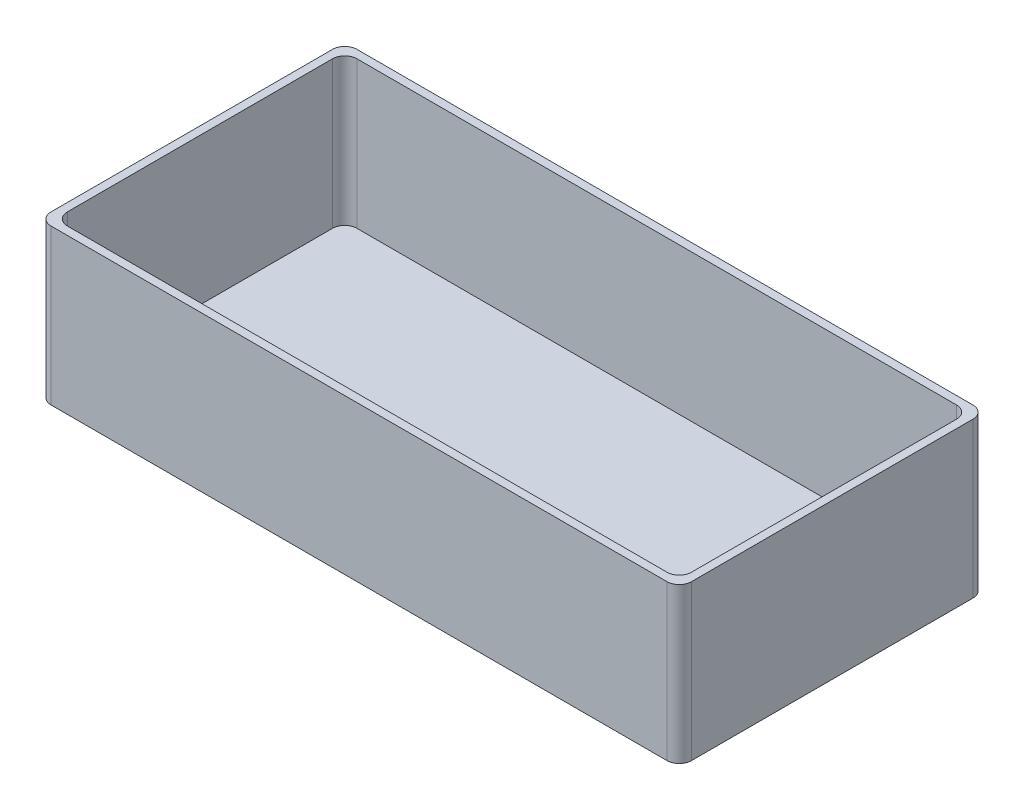
ISO-10303-21;
HEADER;
FILE_DESCRIPTION(('STEP AP214'),'2;1');
FILE_NAME('part.step','',(''),(''),'','','');
FILE_SCHEMA(('AUTOMOTIVE_DESIGN { 1 0 10303 214 1 1 1 1 }'));
ENDSEC;
DATA;
#1=APPLICATION_CONTEXT('core data for automotive mechanical design processes');
#2=APPLICATION_PROTOCOL_DEFINITION('international standard','automotive_design',2000,#1);
#3=PRODUCT_CONTEXT('',#1,'mechanical');
#4=PRODUCT('Part','Part','',(#3));
#5=PRODUCT_RELATED_PRODUCT_CATEGORY('part','',(#4));
#6=PRODUCT_DEFINITION_FORMATION('','',#4);
#7=PRODUCT_DEFINITION_CONTEXT('part definition',#1,'design');
#8=PRODUCT_DEFINITION('design','',#6,#7);
#9=PRODUCT_DEFINITION_SHAPE('','',#8);
#10=(LENGTH_UNIT() NAMED_UNIT(*) SI_UNIT(.MILLI.,.METRE.));
#11=(NAMED_UNIT(*) PLANE_ANGLE_UNIT() SI_UNIT($,.RADIAN.));
#12=(NAMED_UNIT(*) SI_UNIT($,.STERADIAN.) SOLID_ANGLE_UNIT());
#13=UNCERTAINTY_MEASURE_WITH_UNIT(LENGTH_MEASURE(1.E-05),#10,'distance_accuracy_value','');
#14=(GEOMETRIC_REPRESENTATION_CONTEXT(3) GLOBAL_UNCERTAINTY_ASSIGNED_CONTEXT((#13)) GLOBAL_UNIT_ASSIGNED_CONTEXT((#10,
#11,#12)) REPRESENTATION_CONTEXT('',''));
#15=CARTESIAN_POINT('',(0.,0.,0.));
#16=DIRECTION('',(0.,0.,1.));
#17=DIRECTION('',(1.,0.,0.));
#18=AXIS2_PLACEMENT_3D('',#15,#16,#17);
#19=CARTESIAN_POINT('',(0.,38.,0.));
#20=DIRECTION('',(-1.,0.,0.));
#21=DIRECTION('',(0.,0.,1.));
#22=AXIS2_PLACEMENT_3D('',#19,#20,#21);
#23=PLANE('',#22);
#24=DIRECTION('',(0.,0.,-1.));
#25=VECTOR('',#24,1.);
#26=CARTESIAN_POINT('',(0.,38.,0.));
#27=LINE('',#26,#25);
#28=CARTESIAN_POINT('',(0.,38.,-3.));
#29=VERTEX_POINT('',#28);
#30=CARTESIAN_POINT('',(0.,38.,-72.));
#31=VERTEX_POINT('',#30);
#32=EDGE_CURVE('E271',#29,#31,#27,.T.);
#33=ORIENTED_EDGE('',*,*,#32,.F.);
#34=DIRECTION('',(0.,-1.,0.));
#35=VECTOR('',#34,1.);
#36=CARTESIAN_POINT('',(0.,38.,-3.));
#37=LINE('',#36,#35);
#38=CARTESIAN_POINT('',(0.,0.,-3.));
#39=VERTEX_POINT('',#38);
#40=EDGE_CURVE('E192',#29,#39,#37,.T.);
#41=ORIENTED_EDGE('',*,*,#40,.T.);
#42=DIRECTION('',(0.,0.,-1.));
#43=VECTOR('',#42,1.);
#44=CARTESIAN_POINT('',(0.,0.,0.));
#45=LINE('',#44,#43);
#46=CARTESIAN_POINT('',(0.,0.,-72.));
#47=VERTEX_POINT('',#46);
#48=EDGE_CURVE('E270',#39,#47,#45,.T.);
#49=ORIENTED_EDGE('',*,*,#48,.T.);
#50=DIRECTION('',(0.,-1.,0.));
#51=VECTOR('',#50,1.);
#52=CARTESIAN_POINT('',(0.,38.,-72.));
#53=LINE('',#52,#51);
#54=EDGE_CURVE('E190',#47,#31,#53,.F.);
#55=ORIENTED_EDGE('',*,*,#54,.T.);
#56=EDGE_LOOP('',(#33,#41,#49,#55));
#57=FACE_BOUND('',#56,.T.);
#58=ADVANCED_FACE('F33',(#57),#23,.F.);
#59=CARTESIAN_POINT('',(0.,38.,-75.));
#60=DIRECTION('',(0.,0.,1.));
#61=DIRECTION('',(1.,0.,0.));
#62=AXIS2_PLACEMENT_3D('',#59,#60,#61);
#63=PLANE('',#62);
#64=DIRECTION('',(-1.,0.,0.));
#65=VECTOR('',#64,1.);
#66=CARTESIAN_POINT('',(0.,38.,-75.));
#67=LINE('',#66,#65);
#68=CARTESIAN_POINT('',(-3.,38.,-75.));
#69=VERTEX_POINT('',#68);
#70=CARTESIAN_POINT('',(-154.,38.,-75.));
#71=VERTEX_POINT('',#70);
#72=EDGE_CURVE('E274',#69,#71,#67,.T.);
#73=ORIENTED_EDGE('',*,*,#72,.F.);
#74=DIRECTION('',(0.,-1.,0.));
#75=VECTOR('',#74,1.);
#76=CARTESIAN_POINT('',(-3.,38.,-75.));
#77=LINE('',#76,#75);
#78=CARTESIAN_POINT('',(-3.,0.,-75.));
#79=VERTEX_POINT('',#78);
#80=EDGE_CURVE('E222',#69,#79,#77,.T.);
#81=ORIENTED_EDGE('',*,*,#80,.T.);
#82=DIRECTION('',(-1.,0.,0.));
#83=VECTOR('',#82,1.);
#84=CARTESIAN_POINT('',(0.,0.,-75.));
#85=LINE('',#84,#83);
#86=CARTESIAN_POINT('',(-154.,0.,-75.));
#87=VERTEX_POINT('',#86);
#88=EDGE_CURVE('E279',#79,#87,#85,.T.);
#89=ORIENTED_EDGE('',*,*,#88,.T.);
#90=DIRECTION('',(0.,-1.,0.));
#91=VECTOR('',#90,1.);
#92=CARTESIAN_POINT('',(-154.,38.,-75.));
#93=LINE('',#92,#91);
#94=EDGE_CURVE('E220',#87,#71,#93,.F.);
#95=ORIENTED_EDGE('',*,*,#94,.T.);
#96=EDGE_LOOP('',(#73,#81,#89,#95));
#97=FACE_BOUND('',#96,.T.);
#98=ADVANCED_FACE('F305',(#97),#63,.F.);
#99=CARTESIAN_POINT('',(-157.,38.,0.));
#100=DIRECTION('',(1.,0.,0.));
#101=DIRECTION('',(0.,0.,-1.));
#102=AXIS2_PLACEMENT_3D('',#99,#100,#101);
#103=PLANE('',#102);
#104=DIRECTION('',(0.,0.,1.));
#105=VECTOR('',#104,1.);
#106=CARTESIAN_POINT('',(-157.,38.,0.));
#107=LINE('',#106,#105);
#108=CARTESIAN_POINT('',(-157.,38.,-72.));
#109=VERTEX_POINT('',#108);
#110=CARTESIAN_POINT('',(-157.,38.,-2.99999999999998));
#111=VERTEX_POINT('',#110);
#112=EDGE_CURVE('E174',#109,#111,#107,.T.);
#113=ORIENTED_EDGE('',*,*,#112,.F.);
#114=DIRECTION('',(0.,-1.,0.));
#115=VECTOR('',#114,1.);
#116=CARTESIAN_POINT('',(-157.,38.,-72.));
#117=LINE('',#116,#115);
#118=CARTESIAN_POINT('',(-157.,0.,-72.));
#119=VERTEX_POINT('',#118);
#120=EDGE_CURVE('E230',#109,#119,#117,.T.);
#121=ORIENTED_EDGE('',*,*,#120,.T.);
#122=DIRECTION('',(0.,0.,1.));
#123=VECTOR('',#122,1.);
#124=CARTESIAN_POINT('',(-157.,0.,0.));
#125=LINE('',#124,#123);
#126=CARTESIAN_POINT('',(-157.,0.,-2.99999999999998));
#127=VERTEX_POINT('',#126);
#128=EDGE_CURVE('E281',#119,#127,#125,.T.);
#129=ORIENTED_EDGE('',*,*,#128,.T.);
#130=DIRECTION('',(0.,-1.,0.));
#131=VECTOR('',#130,1.);
#132=CARTESIAN_POINT('',(-157.,38.,-2.99999999999998));
#133=LINE('',#132,#131);
#134=EDGE_CURVE('E48',#127,#111,#133,.F.);
#135=ORIENTED_EDGE('',*,*,#134,.T.);
#136=EDGE_LOOP('',(#113,#121,#129,#135));
#137=FACE_BOUND('',#136,.T.);
#138=ADVANCED_FACE('F311',(#137),#103,.F.);
#139=CARTESIAN_POINT('',(0.,38.,0.));
#140=DIRECTION('',(0.,0.,-1.));
#141=DIRECTION('',(-1.,0.,0.));
#142=AXIS2_PLACEMENT_3D('',#139,#140,#141);
#143=PLANE('',#142);
#144=DIRECTION('',(1.,0.,0.));
#145=VECTOR('',#144,1.);
#146=CARTESIAN_POINT('',(0.,0.,0.));
#147=LINE('',#146,#145);
#148=CARTESIAN_POINT('',(-154.,0.,0.));
#149=VERTEX_POINT('',#148);
#150=CARTESIAN_POINT('',(-3.,0.,0.));
#151=VERTEX_POINT('',#150);
#152=EDGE_CURVE('E177',#149,#151,#147,.T.);
#153=ORIENTED_EDGE('',*,*,#152,.T.);
#154=DIRECTION('',(0.,-1.,0.));
#155=VECTOR('',#154,1.);
#156=CARTESIAN_POINT('',(-3.,38.,0.));
#157=LINE('',#156,#155);
#158=CARTESIAN_POINT('',(-3.,38.,0.));
#159=VERTEX_POINT('',#158);
#160=EDGE_CURVE('E206',#151,#159,#157,.F.);
#161=ORIENTED_EDGE('',*,*,#160,.T.);
#162=DIRECTION('',(1.,0.,0.));
#163=VECTOR('',#162,1.);
#164=CARTESIAN_POINT('',(0.,38.,0.));
#165=LINE('',#164,#163);
#166=CARTESIAN_POINT('',(-154.,38.,0.));
#167=VERTEX_POINT('',#166);
#168=EDGE_CURVE('E170',#167,#159,#165,.T.);
#169=ORIENTED_EDGE('',*,*,#168,.F.);
#170=DIRECTION('',(0.,-1.,0.));
#171=VECTOR('',#170,1.);
#172=CARTESIAN_POINT('',(-154.,38.,0.));
#173=LINE('',#172,#171);
#174=EDGE_CURVE('E203',#167,#149,#173,.T.);
#175=ORIENTED_EDGE('',*,*,#174,.T.);
#176=EDGE_LOOP('',(#153,#161,#169,#175));
#177=FACE_BOUND('',#176,.T.);
#178=ADVANCED_FACE('F287',(#177),#143,.F.);
#179=CARTESIAN_POINT('',(0.,38.,0.));
#180=DIRECTION('',(0.,1.,0.));
#181=DIRECTION('',(0.,0.,1.));
#182=AXIS2_PLACEMENT_3D('',#179,#180,#181);
#183=PLANE('',#182);
#184=DIRECTION('',(0.,0.,-1.));
#185=VECTOR('',#184,1.);
#186=CARTESIAN_POINT('',(-2.,38.,0.));
#187=LINE('',#186,#185);
#188=CARTESIAN_POINT('',(-2.,38.,-5.));
#189=VERTEX_POINT('',#188);
#190=CARTESIAN_POINT('',(-2.,38.,-70.));
#191=VERTEX_POINT('',#190);
#192=EDGE_CURVE('E167',#189,#191,#187,.T.);
#193=ORIENTED_EDGE('',*,*,#192,.F.);
#194=CARTESIAN_POINT('',(-5.,38.,-5.));
#195=DIRECTION('',(0.,1.,0.));
#196=DIRECTION('',(0.,0.,1.));
#197=AXIS2_PLACEMENT_3D('',#194,#195,#196);
#198=CIRCLE('',#197,3.);
#199=CARTESIAN_POINT('',(-5.,38.,-2.));
#200=VERTEX_POINT('',#199);
#201=EDGE_CURVE('E233',#189,#200,#198,.F.);
#202=ORIENTED_EDGE('',*,*,#201,.T.);
#203=DIRECTION('',(1.,0.,0.));
#204=VECTOR('',#203,1.);
#205=CARTESIAN_POINT('',(0.,38.,-2.));
#206=LINE('',#205,#204);
#207=CARTESIAN_POINT('',(-152.,38.,-1.99999999999998));
#208=VERTEX_POINT('',#207);
#209=EDGE_CURVE('E268',#208,#200,#206,.T.);
#210=ORIENTED_EDGE('',*,*,#209,.F.);
#211=CARTESIAN_POINT('',(-152.,38.,-4.99999999999998));
#212=DIRECTION('',(0.,1.,0.));
#213=DIRECTION('',(0.,0.,1.));
#214=AXIS2_PLACEMENT_3D('',#211,#212,#213);
#215=CIRCLE('',#214,3.);
#216=CARTESIAN_POINT('',(-155.,38.,-4.99999999999998));
#217=VERTEX_POINT('',#216);
#218=EDGE_CURVE('E11',#208,#217,#215,.F.);
#219=ORIENTED_EDGE('',*,*,#218,.T.);
#220=DIRECTION('',(0.,0.,1.));
#221=VECTOR('',#220,1.);
#222=CARTESIAN_POINT('',(-155.,38.,0.));
#223=LINE('',#222,#221);
#224=CARTESIAN_POINT('',(-155.,38.,-70.));
#225=VERTEX_POINT('',#224);
#226=EDGE_CURVE('E246',#225,#217,#223,.T.);
#227=ORIENTED_EDGE('',*,*,#226,.F.);
#228=CARTESIAN_POINT('',(-152.,38.,-70.));
#229=DIRECTION('',(0.,1.,0.));
#230=DIRECTION('',(0.,0.,1.));
#231=AXIS2_PLACEMENT_3D('',#228,#229,#230);
#232=CIRCLE('',#231,3.);
#233=CARTESIAN_POINT('',(-152.,38.,-73.));
#234=VERTEX_POINT('',#233);
#235=EDGE_CURVE('E41',#225,#234,#232,.F.);
#236=ORIENTED_EDGE('',*,*,#235,.T.);
#237=DIRECTION('',(-1.,0.,0.));
#238=VECTOR('',#237,1.);
#239=CARTESIAN_POINT('',(0.,38.,-73.));
#240=LINE('',#239,#238);
#241=CARTESIAN_POINT('',(-5.,38.,-73.));
#242=VERTEX_POINT('',#241);
#243=EDGE_CURVE('E243',#242,#234,#240,.T.);
#244=ORIENTED_EDGE('',*,*,#243,.F.);
#245=CARTESIAN_POINT('',(-5.,38.,-70.));
#246=DIRECTION('',(0.,1.,0.));
#247=DIRECTION('',(0.,0.,1.));
#248=AXIS2_PLACEMENT_3D('',#245,#246,#247);
#249=CIRCLE('',#248,3.);
#250=EDGE_CURVE('E235',#242,#191,#249,.F.);
#251=ORIENTED_EDGE('',*,*,#250,.T.);
#252=EDGE_LOOP('',(#193,#202,#210,#219,#227,#236,#244,#251));
#253=FACE_BOUND('',#252,.T.);
#254=ORIENTED_EDGE('',*,*,#168,.T.);
#255=CARTESIAN_POINT('',(-3.,38.,-3.));
#256=DIRECTION('',(0.,1.,0.));
#257=DIRECTION('',(0.,0.,1.));
#258=AXIS2_PLACEMENT_3D('',#255,#256,#257);
#259=CIRCLE('',#258,3.);
#260=EDGE_CURVE('E213',#159,#29,#259,.T.);
#261=ORIENTED_EDGE('',*,*,#260,.T.);
#262=ORIENTED_EDGE('',*,*,#32,.T.);
#263=CARTESIAN_POINT('',(-3.,38.,-72.));
#264=DIRECTION('',(0.,1.,0.));
#265=DIRECTION('',(0.,0.,1.));
#266=AXIS2_PLACEMENT_3D('',#263,#264,#265);
#267=CIRCLE('',#266,3.);
#268=EDGE_CURVE('E211',#31,#69,#267,.T.);
#269=ORIENTED_EDGE('',*,*,#268,.T.);
#270=ORIENTED_EDGE('',*,*,#72,.T.);
#271=CARTESIAN_POINT('',(-154.,38.,-72.));
#272=DIRECTION('',(0.,1.,0.));
#273=DIRECTION('',(0.,0.,1.));
#274=AXIS2_PLACEMENT_3D('',#271,#272,#273);
#275=CIRCLE('',#274,3.);
#276=EDGE_CURVE('E55',#71,#109,#275,.T.);
#277=ORIENTED_EDGE('',*,*,#276,.T.);
#278=ORIENTED_EDGE('',*,*,#112,.T.);
#279=CARTESIAN_POINT('',(-154.,38.,-2.99999999999998));
#280=DIRECTION('',(0.,1.,0.));
#281=DIRECTION('',(0.,0.,1.));
#282=AXIS2_PLACEMENT_3D('',#279,#280,#281);
#283=CIRCLE('',#282,3.);
#284=EDGE_CURVE('E208',#111,#167,#283,.T.);
#285=ORIENTED_EDGE('',*,*,#284,.T.);
#286=EDGE_LOOP('',(#254,#261,#262,#269,#270,#277,#278,#285));
#287=FACE_BOUND('',#286,.T.);
#288=ADVANCED_FACE('F242',(#253,#287),#183,.T.);
#289=CARTESIAN_POINT('',(0.,0.,0.));
#290=DIRECTION('',(0.,1.,0.));
#291=DIRECTION('',(0.,0.,1.));
#292=AXIS2_PLACEMENT_3D('',#289,#290,#291);
#293=PLANE('',#292);
#294=ORIENTED_EDGE('',*,*,#48,.F.);
#295=CARTESIAN_POINT('',(-3.,0.,-3.));
#296=DIRECTION('',(0.,1.,0.));
#297=DIRECTION('',(0.,0.,1.));
#298=AXIS2_PLACEMENT_3D('',#295,#296,#297);
#299=CIRCLE('',#298,3.);
#300=EDGE_CURVE('E201',#39,#151,#299,.F.);
#301=ORIENTED_EDGE('',*,*,#300,.T.);
#302=ORIENTED_EDGE('',*,*,#152,.F.);
#303=CARTESIAN_POINT('',(-154.,0.,-2.99999999999998));
#304=DIRECTION('',(0.,1.,0.));
#305=DIRECTION('',(0.,0.,1.));
#306=AXIS2_PLACEMENT_3D('',#303,#304,#305);
#307=CIRCLE('',#306,3.);
#308=EDGE_CURVE('E195',#149,#127,#307,.F.);
#309=ORIENTED_EDGE('',*,*,#308,.T.);
#310=ORIENTED_EDGE('',*,*,#128,.F.);
#311=CARTESIAN_POINT('',(-154.,0.,-72.));
#312=DIRECTION('',(0.,1.,0.));
#313=DIRECTION('',(0.,0.,1.));
#314=AXIS2_PLACEMENT_3D('',#311,#312,#313);
#315=CIRCLE('',#314,3.);
#316=EDGE_CURVE('E197',#119,#87,#315,.F.);
#317=ORIENTED_EDGE('',*,*,#316,.T.);
#318=ORIENTED_EDGE('',*,*,#88,.F.);
#319=CARTESIAN_POINT('',(-3.,0.,-72.));
#320=DIRECTION('',(0.,1.,0.));
#321=DIRECTION('',(0.,0.,1.));
#322=AXIS2_PLACEMENT_3D('',#319,#320,#321);
#323=CIRCLE('',#322,3.);
#324=EDGE_CURVE('E199',#79,#47,#323,.F.);
#325=ORIENTED_EDGE('',*,*,#324,.T.);
#326=EDGE_LOOP('',(#294,#301,#302,#309,#310,#317,#318,#325));
#327=FACE_BOUND('',#326,.T.);
#328=ADVANCED_FACE('F312',(#327),#293,.F.);
#329=CARTESIAN_POINT('',(-2.,38.,0.));
#330=DIRECTION('',(-1.,0.,0.));
#331=DIRECTION('',(0.,0.,1.));
#332=AXIS2_PLACEMENT_3D('',#329,#330,#331);
#333=PLANE('',#332);
#334=DIRECTION('',(0.,0.,-1.));
#335=VECTOR('',#334,1.);
#336=CARTESIAN_POINT('',(-2.,2.,0.));
#337=LINE('',#336,#335);
#338=CARTESIAN_POINT('',(-2.,2.,-5.));
#339=VERTEX_POINT('',#338);
#340=CARTESIAN_POINT('',(-2.,2.,-70.));
#341=VERTEX_POINT('',#340);
#342=EDGE_CURVE('E261',#339,#341,#337,.T.);
#343=ORIENTED_EDGE('',*,*,#342,.F.);
#344=DIRECTION('',(0.,-1.,0.));
#345=VECTOR('',#344,1.);
#346=CARTESIAN_POINT('',(-2.,38.,-5.));
#347=LINE('',#346,#345);
#348=EDGE_CURVE('E188',#339,#189,#347,.F.);
#349=ORIENTED_EDGE('',*,*,#348,.T.);
#350=ORIENTED_EDGE('',*,*,#192,.T.);
#351=DIRECTION('',(0.,-1.,0.));
#352=VECTOR('',#351,1.);
#353=CARTESIAN_POINT('',(-2.,2.,-70.));
#354=LINE('',#353,#352);
#355=EDGE_CURVE('E185',#191,#341,#354,.T.);
#356=ORIENTED_EDGE('',*,*,#355,.T.);
#357=EDGE_LOOP('',(#343,#349,#350,#356));
#358=FACE_BOUND('',#357,.T.);
#359=ADVANCED_FACE('F413',(#358),#333,.T.);
#360=CARTESIAN_POINT('',(0.,38.,-73.));
#361=DIRECTION('',(0.,0.,1.));
#362=DIRECTION('',(1.,0.,0.));
#363=AXIS2_PLACEMENT_3D('',#360,#361,#362);
#364=PLANE('',#363);
#365=DIRECTION('',(-1.,0.,0.));
#366=VECTOR('',#365,1.);
#367=CARTESIAN_POINT('',(0.,2.,-73.));
#368=LINE('',#367,#366);
#369=CARTESIAN_POINT('',(-5.,2.,-73.));
#370=VERTEX_POINT('',#369);
#371=CARTESIAN_POINT('',(-152.,2.,-73.));
#372=VERTEX_POINT('',#371);
#373=EDGE_CURVE('E257',#370,#372,#368,.T.);
#374=ORIENTED_EDGE('',*,*,#373,.F.);
#375=DIRECTION('',(0.,-1.,0.));
#376=VECTOR('',#375,1.);
#377=CARTESIAN_POINT('',(-5.,38.,-73.));
#378=LINE('',#377,#376);
#379=EDGE_CURVE('E218',#370,#242,#378,.F.);
#380=ORIENTED_EDGE('',*,*,#379,.T.);
#381=ORIENTED_EDGE('',*,*,#243,.T.);
#382=DIRECTION('',(0.,-1.,0.));
#383=VECTOR('',#382,1.);
#384=CARTESIAN_POINT('',(-152.,2.,-73.));
#385=LINE('',#384,#383);
#386=EDGE_CURVE('E215',#234,#372,#385,.T.);
#387=ORIENTED_EDGE('',*,*,#386,.T.);
#388=EDGE_LOOP('',(#374,#380,#381,#387));
#389=FACE_BOUND('',#388,.T.);
#390=ADVANCED_FACE('F252',(#389),#364,.T.);
#391=CARTESIAN_POINT('',(-155.,38.,0.));
#392=DIRECTION('',(1.,0.,0.));
#393=DIRECTION('',(0.,0.,-1.));
#394=AXIS2_PLACEMENT_3D('',#391,#392,#393);
#395=PLANE('',#394);
#396=DIRECTION('',(0.,0.,1.));
#397=VECTOR('',#396,1.);
#398=CARTESIAN_POINT('',(-155.,2.,0.));
#399=LINE('',#398,#397);
#400=CARTESIAN_POINT('',(-155.,2.,-70.));
#401=VERTEX_POINT('',#400);
#402=CARTESIAN_POINT('',(-155.,2.,-4.99999999999998));
#403=VERTEX_POINT('',#402);
#404=EDGE_CURVE('E152',#401,#403,#399,.T.);
#405=ORIENTED_EDGE('',*,*,#404,.F.);
#406=DIRECTION('',(0.,-1.,0.));
#407=VECTOR('',#406,1.);
#408=CARTESIAN_POINT('',(-155.,38.,-70.));
#409=LINE('',#408,#407);
#410=EDGE_CURVE('E227',#401,#225,#409,.F.);
#411=ORIENTED_EDGE('',*,*,#410,.T.);
#412=ORIENTED_EDGE('',*,*,#226,.T.);
#413=DIRECTION('',(0.,-1.,0.));
#414=VECTOR('',#413,1.);
#415=CARTESIAN_POINT('',(-155.,2.,-4.99999999999998));
#416=LINE('',#415,#414);
#417=EDGE_CURVE('E225',#217,#403,#416,.T.);
#418=ORIENTED_EDGE('',*,*,#417,.T.);
#419=EDGE_LOOP('',(#405,#411,#412,#418));
#420=FACE_BOUND('',#419,.T.);
#421=ADVANCED_FACE('F259',(#420),#395,.T.);
#422=CARTESIAN_POINT('',(0.,38.,-2.));
#423=DIRECTION('',(0.,0.,-1.));
#424=DIRECTION('',(-1.,0.,0.));
#425=AXIS2_PLACEMENT_3D('',#422,#423,#424);
#426=PLANE('',#425);
#427=ORIENTED_EDGE('',*,*,#209,.T.);
#428=DIRECTION('',(0.,-1.,0.));
#429=VECTOR('',#428,1.);
#430=CARTESIAN_POINT('',(-5.,2.,-2.));
#431=LINE('',#430,#429);
#432=CARTESIAN_POINT('',(-5.,2.,-2.));
#433=VERTEX_POINT('',#432);
#434=EDGE_CURVE('E158',#200,#433,#431,.T.);
#435=ORIENTED_EDGE('',*,*,#434,.T.);
#436=DIRECTION('',(1.,0.,0.));
#437=VECTOR('',#436,1.);
#438=CARTESIAN_POINT('',(0.,2.,-2.));
#439=LINE('',#438,#437);
#440=CARTESIAN_POINT('',(-152.,2.,-1.99999999999998));
#441=VERTEX_POINT('',#440);
#442=EDGE_CURVE('E150',#441,#433,#439,.T.);
#443=ORIENTED_EDGE('',*,*,#442,.F.);
#444=DIRECTION('',(0.,-1.,0.));
#445=VECTOR('',#444,1.);
#446=CARTESIAN_POINT('',(-152.,38.,-1.99999999999998));
#447=LINE('',#446,#445);
#448=EDGE_CURVE('E164',#441,#208,#447,.F.);
#449=ORIENTED_EDGE('',*,*,#448,.T.);
#450=EDGE_LOOP('',(#427,#435,#443,#449));
#451=FACE_BOUND('',#450,.T.);
#452=ADVANCED_FACE('F163',(#451),#426,.T.);
#453=CARTESIAN_POINT('',(0.,2.,0.));
#454=DIRECTION('',(0.,1.,0.));
#455=DIRECTION('',(0.,0.,1.));
#456=AXIS2_PLACEMENT_3D('',#453,#454,#455);
#457=PLANE('',#456);
#458=ORIENTED_EDGE('',*,*,#442,.T.);
#459=CARTESIAN_POINT('',(-5.,2.,-5.));
#460=DIRECTION('',(0.,1.,0.));
#461=DIRECTION('',(0.,0.,1.));
#462=AXIS2_PLACEMENT_3D('',#459,#460,#461);
#463=CIRCLE('',#462,3.);
#464=EDGE_CURVE('E183',#433,#339,#463,.T.);
#465=ORIENTED_EDGE('',*,*,#464,.T.);
#466=ORIENTED_EDGE('',*,*,#342,.T.);
#467=CARTESIAN_POINT('',(-5.,2.,-70.));
#468=DIRECTION('',(0.,1.,0.));
#469=DIRECTION('',(0.,0.,1.));
#470=AXIS2_PLACEMENT_3D('',#467,#468,#469);
#471=CIRCLE('',#470,3.);
#472=EDGE_CURVE('E181',#341,#370,#471,.T.);
#473=ORIENTED_EDGE('',*,*,#472,.T.);
#474=ORIENTED_EDGE('',*,*,#373,.T.);
#475=CARTESIAN_POINT('',(-152.,2.,-70.));
#476=DIRECTION('',(0.,1.,0.));
#477=DIRECTION('',(0.,0.,1.));
#478=AXIS2_PLACEMENT_3D('',#475,#476,#477);
#479=CIRCLE('',#478,3.);
#480=EDGE_CURVE('E157',#372,#401,#479,.T.);
#481=ORIENTED_EDGE('',*,*,#480,.T.);
#482=ORIENTED_EDGE('',*,*,#404,.T.);
#483=CARTESIAN_POINT('',(-152.,2.,-4.99999999999998));
#484=DIRECTION('',(0.,1.,0.));
#485=DIRECTION('',(0.,0.,1.));
#486=AXIS2_PLACEMENT_3D('',#483,#484,#485);
#487=CIRCLE('',#486,3.);
#488=EDGE_CURVE('E147',#403,#441,#487,.T.);
#489=ORIENTED_EDGE('',*,*,#488,.T.);
#490=EDGE_LOOP('',(#458,#465,#466,#473,#474,#481,#482,#489));
#491=FACE_BOUND('',#490,.T.);
#492=ADVANCED_FACE('F149',(#491),#457,.T.);
#493=CARTESIAN_POINT('',(-5.,38.,-5.));
#494=DIRECTION('',(0.,1.,0.));
#495=DIRECTION('',(0.,0.,1.));
#496=AXIS2_PLACEMENT_3D('',#493,#494,#495);
#497=CYLINDRICAL_SURFACE('',#496,3.);
#498=ORIENTED_EDGE('',*,*,#201,.F.);
#499=ORIENTED_EDGE('',*,*,#348,.F.);
#500=ORIENTED_EDGE('',*,*,#464,.F.);
#501=ORIENTED_EDGE('',*,*,#434,.F.);
#502=EDGE_LOOP('',(#498,#499,#500,#501));
#503=FACE_BOUND('',#502,.T.);
#504=ADVANCED_FACE('F330',(#503),#497,.F.);
#505=CARTESIAN_POINT('',(-3.,38.,-3.));
#506=DIRECTION('',(0.,-1.,0.));
#507=DIRECTION('',(0.,0.,-1.));
#508=AXIS2_PLACEMENT_3D('',#505,#506,#507);
#509=CYLINDRICAL_SURFACE('',#508,3.);
#510=ORIENTED_EDGE('',*,*,#260,.F.);
#511=ORIENTED_EDGE('',*,*,#160,.F.);
#512=ORIENTED_EDGE('',*,*,#300,.F.);
#513=ORIENTED_EDGE('',*,*,#40,.F.);
#514=EDGE_LOOP('',(#510,#511,#512,#513));
#515=FACE_BOUND('',#514,.T.);
#516=ADVANCED_FACE('F293',(#515),#509,.T.);
#517=CARTESIAN_POINT('',(-5.,38.,-70.));
#518=DIRECTION('',(0.,1.,0.));
#519=DIRECTION('',(0.,0.,1.));
#520=AXIS2_PLACEMENT_3D('',#517,#518,#519);
#521=CYLINDRICAL_SURFACE('',#520,3.);
#522=ORIENTED_EDGE('',*,*,#250,.F.);
#523=ORIENTED_EDGE('',*,*,#379,.F.);
#524=ORIENTED_EDGE('',*,*,#472,.F.);
#525=ORIENTED_EDGE('',*,*,#355,.F.);
#526=EDGE_LOOP('',(#522,#523,#524,#525));
#527=FACE_BOUND('',#526,.T.);
#528=ADVANCED_FACE('F336',(#527),#521,.F.);
#529=CARTESIAN_POINT('',(-3.,38.,-72.));
#530=DIRECTION('',(0.,-1.,0.));
#531=DIRECTION('',(0.,0.,-1.));
#532=AXIS2_PLACEMENT_3D('',#529,#530,#531);
#533=CYLINDRICAL_SURFACE('',#532,3.);
#534=ORIENTED_EDGE('',*,*,#268,.F.);
#535=ORIENTED_EDGE('',*,*,#54,.F.);
#536=ORIENTED_EDGE('',*,*,#324,.F.);
#537=ORIENTED_EDGE('',*,*,#80,.F.);
#538=EDGE_LOOP('',(#534,#535,#536,#537));
#539=FACE_BOUND('',#538,.T.);
#540=ADVANCED_FACE('F301',(#539),#533,.T.);
#541=CARTESIAN_POINT('',(-152.,38.,-70.));
#542=DIRECTION('',(0.,1.,0.));
#543=DIRECTION('',(0.,0.,1.));
#544=AXIS2_PLACEMENT_3D('',#541,#542,#543);
#545=CYLINDRICAL_SURFACE('',#544,3.);
#546=ORIENTED_EDGE('',*,*,#235,.F.);
#547=ORIENTED_EDGE('',*,*,#410,.F.);
#548=ORIENTED_EDGE('',*,*,#480,.F.);
#549=ORIENTED_EDGE('',*,*,#386,.F.);
#550=EDGE_LOOP('',(#546,#547,#548,#549));
#551=FACE_BOUND('',#550,.T.);
#552=ADVANCED_FACE('F256',(#551),#545,.F.);
#553=CARTESIAN_POINT('',(-154.,38.,-72.));
#554=DIRECTION('',(0.,-1.,0.));
#555=DIRECTION('',(0.,0.,-1.));
#556=AXIS2_PLACEMENT_3D('',#553,#554,#555);
#557=CYLINDRICAL_SURFACE('',#556,3.);
#558=ORIENTED_EDGE('',*,*,#276,.F.);
#559=ORIENTED_EDGE('',*,*,#94,.F.);
#560=ORIENTED_EDGE('',*,*,#316,.F.);
#561=ORIENTED_EDGE('',*,*,#120,.F.);
#562=EDGE_LOOP('',(#558,#559,#560,#561));
#563=FACE_BOUND('',#562,.T.);
#564=ADVANCED_FACE('F309',(#563),#557,.T.);
#565=CARTESIAN_POINT('',(-154.,38.,-2.99999999999998));
#566=DIRECTION('',(0.,-1.,0.));
#567=DIRECTION('',(0.,0.,-1.));
#568=AXIS2_PLACEMENT_3D('',#565,#566,#567);
#569=CYLINDRICAL_SURFACE('',#568,3.);
#570=ORIENTED_EDGE('',*,*,#284,.F.);
#571=ORIENTED_EDGE('',*,*,#134,.F.);
#572=ORIENTED_EDGE('',*,*,#308,.F.);
#573=ORIENTED_EDGE('',*,*,#174,.F.);
#574=EDGE_LOOP('',(#570,#571,#572,#573));
#575=FACE_BOUND('',#574,.T.);
#576=ADVANCED_FACE('F315',(#575),#569,.T.);
#577=CARTESIAN_POINT('',(-152.,38.,-4.99999999999998));
#578=DIRECTION('',(0.,1.,0.));
#579=DIRECTION('',(0.,0.,1.));
#580=AXIS2_PLACEMENT_3D('',#577,#578,#579);
#581=CYLINDRICAL_SURFACE('',#580,3.);
#582=ORIENTED_EDGE('',*,*,#218,.F.);
#583=ORIENTED_EDGE('',*,*,#448,.F.);
#584=ORIENTED_EDGE('',*,*,#488,.F.);
#585=ORIENTED_EDGE('',*,*,#417,.F.);
#586=EDGE_LOOP('',(#582,#583,#584,#585));
#587=FACE_BOUND('',#586,.T.);
#588=ADVANCED_FACE('F35',(#587),#581,.F.);
#589=CLOSED_SHELL('',(#58,#98,#138,#178,#288,#328,#359,#390,#421,#452,#492,#504,#516,#528,#540,
#552,#564,#576,#588));
#590=MANIFOLD_SOLID_BREP('B2',#589);
#591=ADVANCED_BREP_SHAPE_REPRESENTATION('',(#18,#590),#14);
#592=SHAPE_DEFINITION_REPRESENTATION(#9,#591);
ENDSEC;
END-ISO-10303-21;
